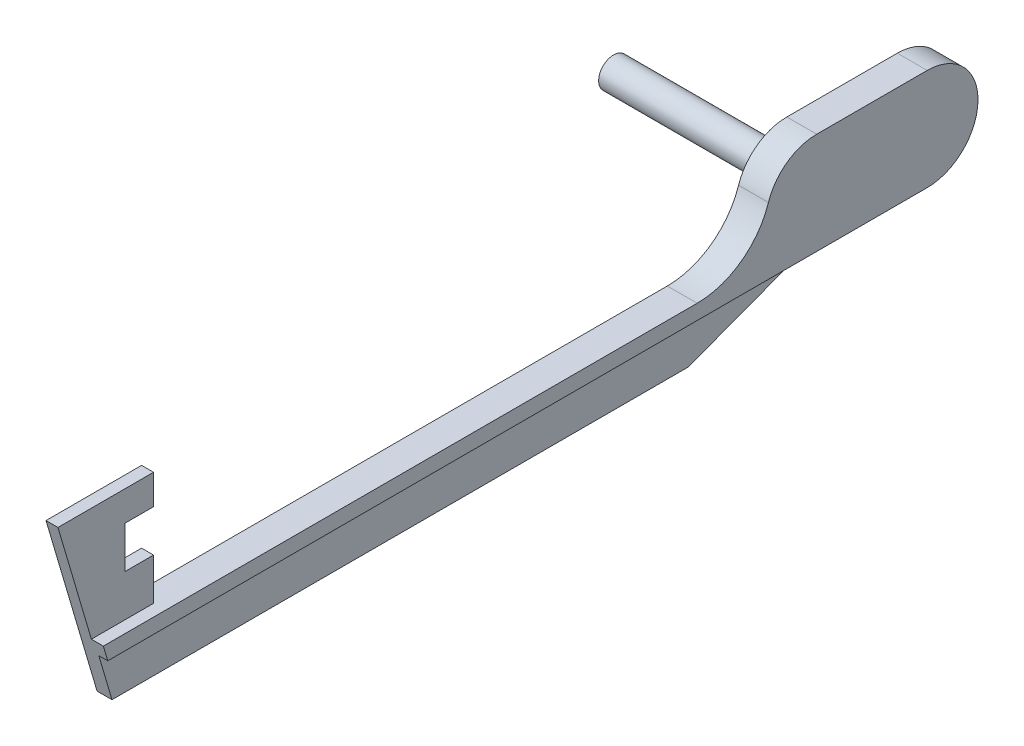
ISO-10303-21;
HEADER;
FILE_DESCRIPTION(('STEP AP214'),'2;1');
FILE_NAME('part.step','',(''),(''),'','','');
FILE_SCHEMA(('AUTOMOTIVE_DESIGN { 1 0 10303 214 1 1 1 1 }'));
ENDSEC;
DATA;
#1=APPLICATION_CONTEXT('core data for automotive mechanical design processes');
#2=APPLICATION_PROTOCOL_DEFINITION('international standard','automotive_design',2000,#1);
#3=PRODUCT_CONTEXT('',#1,'mechanical');
#4=PRODUCT('Part','Part','',(#3));
#5=PRODUCT_RELATED_PRODUCT_CATEGORY('part','',(#4));
#6=PRODUCT_DEFINITION_FORMATION('','',#4);
#7=PRODUCT_DEFINITION_CONTEXT('part definition',#1,'design');
#8=PRODUCT_DEFINITION('design','',#6,#7);
#9=PRODUCT_DEFINITION_SHAPE('','',#8);
#10=(LENGTH_UNIT() NAMED_UNIT(*) SI_UNIT(.MILLI.,.METRE.));
#11=(NAMED_UNIT(*) PLANE_ANGLE_UNIT() SI_UNIT($,.RADIAN.));
#12=(NAMED_UNIT(*) SI_UNIT($,.STERADIAN.) SOLID_ANGLE_UNIT());
#13=UNCERTAINTY_MEASURE_WITH_UNIT(LENGTH_MEASURE(1.E-05),#10,'distance_accuracy_value','');
#14=(GEOMETRIC_REPRESENTATION_CONTEXT(3) GLOBAL_UNCERTAINTY_ASSIGNED_CONTEXT((#13)) GLOBAL_UNIT_ASSIGNED_CONTEXT((#10,
#11,#12)) REPRESENTATION_CONTEXT('',''));
#15=CARTESIAN_POINT('',(0.,0.,0.));
#16=DIRECTION('',(0.,0.,1.));
#17=DIRECTION('',(1.,0.,0.));
#18=AXIS2_PLACEMENT_3D('',#15,#16,#17);
#19=CARTESIAN_POINT('',(2.54,-3.048,0.));
#20=DIRECTION('',(0.,-1.,0.));
#21=DIRECTION('',(0.,0.,-1.));
#22=AXIS2_PLACEMENT_3D('',#19,#20,#21);
#23=PLANE('',#22);
#24=DIRECTION('',(0.,0.,1.));
#25=VECTOR('',#24,1.);
#26=CARTESIAN_POINT('',(0.,-3.048,0.));
#27=LINE('',#26,#25);
#28=CARTESIAN_POINT('',(0.,-3.048,19.558));
#29=VERTEX_POINT('',#28);
#30=CARTESIAN_POINT('',(0.,-3.048,64.77));
#31=VERTEX_POINT('',#30);
#32=EDGE_CURVE('E265',#29,#31,#27,.T.);
#33=ORIENTED_EDGE('',*,*,#32,.T.);
#34=DIRECTION('',(1.,0.,0.));
#35=VECTOR('',#34,1.);
#36=CARTESIAN_POINT('',(0.254,-3.048,64.77));
#37=LINE('',#36,#35);
#38=CARTESIAN_POINT('',(0.508,-3.048,64.77));
#39=VERTEX_POINT('',#38);
#40=EDGE_CURVE('E239',#31,#39,#37,.T.);
#41=ORIENTED_EDGE('',*,*,#40,.T.);
#42=CARTESIAN_POINT('',(1.524,-3.048,64.77));
#43=VERTEX_POINT('',#42);
#44=EDGE_CURVE('E225',#39,#43,#37,.T.);
#45=ORIENTED_EDGE('',*,*,#44,.T.);
#46=DIRECTION('',(0.,0.,1.));
#47=VECTOR('',#46,1.);
#48=CARTESIAN_POINT('',(1.524,-3.04799999999999,0.));
#49=LINE('',#48,#47);
#50=CARTESIAN_POINT('',(1.524,-3.048,70.0535860198938));
#51=VERTEX_POINT('',#50);
#52=EDGE_CURVE('E203',#43,#51,#49,.T.);
#53=ORIENTED_EDGE('',*,*,#52,.T.);
#54=DIRECTION('',(-1.,0.,0.));
#55=VECTOR('',#54,1.);
#56=CARTESIAN_POINT('',(2.54,-3.048,70.0535860198938));
#57=LINE('',#56,#55);
#58=CARTESIAN_POINT('',(2.54,-3.048,70.0535860198938));
#59=VERTEX_POINT('',#58);
#60=EDGE_CURVE('E278',#59,#51,#57,.T.);
#61=ORIENTED_EDGE('',*,*,#60,.F.);
#62=DIRECTION('',(0.,0.,1.));
#63=VECTOR('',#62,1.);
#64=CARTESIAN_POINT('',(2.54,-3.048,0.));
#65=LINE('',#64,#63);
#66=CARTESIAN_POINT('',(2.54,-3.048,19.558));
#67=VERTEX_POINT('',#66);
#68=EDGE_CURVE('E276',#67,#59,#65,.T.);
#69=ORIENTED_EDGE('',*,*,#68,.F.);
#70=DIRECTION('',(-1.,0.,0.));
#71=VECTOR('',#70,1.);
#72=CARTESIAN_POINT('',(2.54,-3.048,19.558));
#73=LINE('',#72,#71);
#74=EDGE_CURVE('E293',#67,#29,#73,.T.);
#75=ORIENTED_EDGE('',*,*,#74,.T.);
#76=EDGE_LOOP('',(#33,#41,#45,#53,#61,#69,#75));
#77=FACE_BOUND('',#76,.T.);
#78=ADVANCED_FACE('F34',(#77),#23,.F.);
#79=CARTESIAN_POINT('',(2.54,-19.2384881202228,65.2823001978979));
#80=DIRECTION('',(0.,0.282677628483706,-0.959214969834618));
#81=DIRECTION('',(0.,0.959214969834619,0.282677628483706));
#82=AXIS2_PLACEMENT_3D('',#79,#80,#81);
#83=PLANE('',#82);
#84=DIRECTION('',(1.,0.,0.));
#85=VECTOR('',#84,1.);
#86=CARTESIAN_POINT('',(0.254,6.604,72.898));
#87=LINE('',#86,#85);
#88=CARTESIAN_POINT('',(0.508,6.604,72.898));
#89=VERTEX_POINT('',#88);
#90=CARTESIAN_POINT('',(1.524,6.604,72.898));
#91=VERTEX_POINT('',#90);
#92=EDGE_CURVE('E226',#89,#91,#87,.T.);
#93=ORIENTED_EDGE('',*,*,#92,.F.);
#94=DIRECTION('',(0.,-0.959214969834619,-0.282677628483706));
#95=VECTOR('',#94,1.);
#96=CARTESIAN_POINT('',(0.508,-19.2384881202228,65.2823001978979));
#97=LINE('',#96,#95);
#98=CARTESIAN_POINT('',(0.508,-8.12800000000001,68.5565260303642));
#99=VERTEX_POINT('',#98);
#100=EDGE_CURVE('E197',#89,#99,#97,.T.);
#101=ORIENTED_EDGE('',*,*,#100,.T.);
#102=DIRECTION('',(-1.,0.,0.));
#103=VECTOR('',#102,1.);
#104=CARTESIAN_POINT('',(1.778,-8.128,68.5565260303642));
#105=LINE('',#104,#103);
#106=CARTESIAN_POINT('',(1.778,-8.128,68.5565260303642));
#107=VERTEX_POINT('',#106);
#108=EDGE_CURVE('E186',#107,#99,#105,.T.);
#109=ORIENTED_EDGE('',*,*,#108,.F.);
#110=DIRECTION('',(0.,-0.959214969834618,-0.282677628483706));
#111=VECTOR('',#110,1.);
#112=CARTESIAN_POINT('',(1.778,-19.2384881202228,65.2823001978979));
#113=LINE('',#112,#111);
#114=CARTESIAN_POINT('',(1.778,-4.318,69.6793210225114));
#115=VERTEX_POINT('',#114);
#116=EDGE_CURVE('E248',#115,#107,#113,.T.);
#117=ORIENTED_EDGE('',*,*,#116,.F.);
#118=DIRECTION('',(-1.,0.,0.));
#119=VECTOR('',#118,1.);
#120=CARTESIAN_POINT('',(2.54,-4.318,69.6793210225114));
#121=LINE('',#120,#119);
#122=CARTESIAN_POINT('',(2.54,-4.318,69.6793210225114));
#123=VERTEX_POINT('',#122);
#124=EDGE_CURVE('E11',#123,#115,#121,.T.);
#125=ORIENTED_EDGE('',*,*,#124,.F.);
#126=DIRECTION('',(0.,-0.959214969834618,-0.282677628483706));
#127=VECTOR('',#126,1.);
#128=CARTESIAN_POINT('',(2.54,-19.2384881202228,65.2823001978979));
#129=LINE('',#128,#127);
#130=EDGE_CURVE('E262',#59,#123,#129,.T.);
#131=ORIENTED_EDGE('',*,*,#130,.F.);
#132=ORIENTED_EDGE('',*,*,#60,.T.);
#133=DIRECTION('',(0.,-0.959214969834618,-0.282677628483706));
#134=VECTOR('',#133,1.);
#135=CARTESIAN_POINT('',(1.524,-19.2384881202228,65.2823001978979));
#136=LINE('',#135,#134);
#137=EDGE_CURVE('E57',#91,#51,#136,.T.);
#138=ORIENTED_EDGE('',*,*,#137,.F.);
#139=EDGE_LOOP('',(#93,#101,#109,#117,#125,#131,#132,#138));
#140=FACE_BOUND('',#139,.T.);
#141=ADVANCED_FACE('F36',(#140),#83,.F.);
#142=CARTESIAN_POINT('',(2.54,-4.318,0.));
#143=DIRECTION('',(0.,-1.,0.));
#144=DIRECTION('',(0.,0.,-1.));
#145=AXIS2_PLACEMENT_3D('',#142,#143,#144);
#146=PLANE('',#145);
#147=DIRECTION('',(-1.,0.,0.));
#148=VECTOR('',#147,1.);
#149=CARTESIAN_POINT('',(1.778,-4.318,9.398));
#150=LINE('',#149,#148);
#151=CARTESIAN_POINT('',(1.778,-4.318,9.398));
#152=VERTEX_POINT('',#151);
#153=CARTESIAN_POINT('',(0.,-4.318,9.398));
#154=VERTEX_POINT('',#153);
#155=EDGE_CURVE('E258',#152,#154,#150,.T.);
#156=ORIENTED_EDGE('',*,*,#155,.T.);
#157=DIRECTION('',(0.,0.,1.));
#158=VECTOR('',#157,1.);
#159=CARTESIAN_POINT('',(0.,-4.318,0.));
#160=LINE('',#159,#158);
#161=CARTESIAN_POINT('',(0.,-4.318,0.));
#162=VERTEX_POINT('',#161);
#163=EDGE_CURVE('E261',#162,#154,#160,.T.);
#164=ORIENTED_EDGE('',*,*,#163,.F.);
#165=DIRECTION('',(-1.,0.,0.));
#166=VECTOR('',#165,1.);
#167=CARTESIAN_POINT('',(2.54,-4.318,0.));
#168=LINE('',#167,#166);
#169=CARTESIAN_POINT('',(2.54,-4.318,0.));
#170=VERTEX_POINT('',#169);
#171=EDGE_CURVE('E42',#170,#162,#168,.T.);
#172=ORIENTED_EDGE('',*,*,#171,.F.);
#173=DIRECTION('',(0.,0.,1.));
#174=VECTOR('',#173,1.);
#175=CARTESIAN_POINT('',(2.54,-4.318,0.));
#176=LINE('',#175,#174);
#177=EDGE_CURVE('E264',#170,#123,#176,.T.);
#178=ORIENTED_EDGE('',*,*,#177,.T.);
#179=ORIENTED_EDGE('',*,*,#124,.T.);
#180=DIRECTION('',(0.,0.,1.));
#181=VECTOR('',#180,1.);
#182=CARTESIAN_POINT('',(1.778,-4.318,0.));
#183=LINE('',#182,#181);
#184=EDGE_CURVE('E245',#152,#115,#183,.T.);
#185=ORIENTED_EDGE('',*,*,#184,.F.);
#186=EDGE_LOOP('',(#156,#164,#172,#178,#179,#185));
#187=FACE_BOUND('',#186,.T.);
#188=ADVANCED_FACE('F316',(#187),#146,.T.);
#189=CARTESIAN_POINT('',(2.54,0.,0.));
#190=DIRECTION('',(-1.,0.,0.));
#191=DIRECTION('',(0.,0.,1.));
#192=AXIS2_PLACEMENT_3D('',#189,#190,#191);
#193=CYLINDRICAL_SURFACE('',#192,4.318);
#194=CARTESIAN_POINT('',(0.,0.,0.));
#195=DIRECTION('',(1.,0.,0.));
#196=DIRECTION('',(0.,0.,-1.));
#197=AXIS2_PLACEMENT_3D('',#194,#195,#196);
#198=CIRCLE('',#197,4.318);
#199=CARTESIAN_POINT('',(0.,4.318,0.));
#200=VERTEX_POINT('',#199);
#201=EDGE_CURVE('E281',#162,#200,#198,.T.);
#202=ORIENTED_EDGE('',*,*,#201,.T.);
#203=DIRECTION('',(-1.,0.,0.));
#204=VECTOR('',#203,1.);
#205=CARTESIAN_POINT('',(2.54,4.318,0.));
#206=LINE('',#205,#204);
#207=CARTESIAN_POINT('',(2.54,4.318,0.));
#208=VERTEX_POINT('',#207);
#209=EDGE_CURVE('E302',#208,#200,#206,.T.);
#210=ORIENTED_EDGE('',*,*,#209,.F.);
#211=CARTESIAN_POINT('',(2.54,0.,0.));
#212=DIRECTION('',(1.,0.,0.));
#213=DIRECTION('',(0.,0.,-1.));
#214=AXIS2_PLACEMENT_3D('',#211,#212,#213);
#215=CIRCLE('',#214,4.318);
#216=EDGE_CURVE('E268',#170,#208,#215,.T.);
#217=ORIENTED_EDGE('',*,*,#216,.F.);
#218=ORIENTED_EDGE('',*,*,#171,.T.);
#219=EDGE_LOOP('',(#202,#210,#217,#218));
#220=FACE_BOUND('',#219,.T.);
#221=ADVANCED_FACE('F307',(#220),#193,.T.);
#222=CARTESIAN_POINT('',(2.54,4.318,0.));
#223=DIRECTION('',(0.,-1.,0.));
#224=DIRECTION('',(0.,0.,-1.));
#225=AXIS2_PLACEMENT_3D('',#222,#223,#224);
#226=PLANE('',#225);
#227=DIRECTION('',(0.,0.,1.));
#228=VECTOR('',#227,1.);
#229=CARTESIAN_POINT('',(0.,4.318,0.));
#230=LINE('',#229,#228);
#231=CARTESIAN_POINT('',(0.,4.318,9.398));
#232=VERTEX_POINT('',#231);
#233=EDGE_CURVE('E283',#200,#232,#230,.T.);
#234=ORIENTED_EDGE('',*,*,#233,.T.);
#235=DIRECTION('',(-1.,0.,0.));
#236=VECTOR('',#235,1.);
#237=CARTESIAN_POINT('',(2.54,4.318,9.398));
#238=LINE('',#237,#236);
#239=CARTESIAN_POINT('',(2.54,4.318,9.398));
#240=VERTEX_POINT('',#239);
#241=EDGE_CURVE('E299',#240,#232,#238,.T.);
#242=ORIENTED_EDGE('',*,*,#241,.F.);
#243=DIRECTION('',(0.,0.,1.));
#244=VECTOR('',#243,1.);
#245=CARTESIAN_POINT('',(2.54,4.318,0.));
#246=LINE('',#245,#244);
#247=EDGE_CURVE('E270',#208,#240,#246,.T.);
#248=ORIENTED_EDGE('',*,*,#247,.F.);
#249=ORIENTED_EDGE('',*,*,#209,.T.);
#250=EDGE_LOOP('',(#234,#242,#248,#249));
#251=FACE_BOUND('',#250,.T.);
#252=ADVANCED_FACE('F341',(#251),#226,.F.);
#253=CARTESIAN_POINT('',(2.54,0.,9.398));
#254=DIRECTION('',(-1.,0.,0.));
#255=DIRECTION('',(0.,0.,1.));
#256=AXIS2_PLACEMENT_3D('',#253,#254,#255);
#257=CYLINDRICAL_SURFACE('',#256,4.318);
#258=CARTESIAN_POINT('',(0.,0.,9.398));
#259=DIRECTION('',(1.,0.,0.));
#260=DIRECTION('',(0.,0.,-1.));
#261=AXIS2_PLACEMENT_3D('',#258,#259,#260);
#262=CIRCLE('',#261,4.318);
#263=CARTESIAN_POINT('',(0.,1.34263088897993,13.5019573945104));
#264=VERTEX_POINT('',#263);
#265=EDGE_CURVE('E285',#232,#264,#262,.T.);
#266=ORIENTED_EDGE('',*,*,#265,.T.);
#267=DIRECTION('',(-1.,0.,0.));
#268=VECTOR('',#267,1.);
#269=CARTESIAN_POINT('',(2.54,1.34263088897993,13.5019573945104));
#270=LINE('',#269,#268);
#271=CARTESIAN_POINT('',(2.54,1.34263088897993,13.5019573945104));
#272=VERTEX_POINT('',#271);
#273=EDGE_CURVE('E296',#272,#264,#270,.T.);
#274=ORIENTED_EDGE('',*,*,#273,.F.);
#275=CARTESIAN_POINT('',(2.54,0.,9.398));
#276=DIRECTION('',(1.,0.,0.));
#277=DIRECTION('',(0.,0.,-1.));
#278=AXIS2_PLACEMENT_3D('',#275,#276,#277);
#279=CIRCLE('',#278,4.318);
#280=EDGE_CURVE('E272',#240,#272,#279,.T.);
#281=ORIENTED_EDGE('',*,*,#280,.F.);
#282=ORIENTED_EDGE('',*,*,#241,.T.);
#283=EDGE_LOOP('',(#266,#274,#281,#282));
#284=FACE_BOUND('',#283,.T.);
#285=ADVANCED_FACE('F336',(#284),#257,.T.);
#286=CARTESIAN_POINT('',(2.54,3.32389655172413,19.558));
#287=DIRECTION('',(-1.,0.,0.));
#288=DIRECTION('',(0.,0.,1.));
#289=AXIS2_PLACEMENT_3D('',#286,#287,#288);
#290=CYLINDRICAL_SURFACE('',#289,6.37189655172413);
#291=CARTESIAN_POINT('',(0.,3.32389655172413,19.558));
#292=DIRECTION('',(1.,0.,0.));
#293=DIRECTION('',(0.,0.,-1.));
#294=AXIS2_PLACEMENT_3D('',#291,#292,#293);
#295=CIRCLE('',#294,6.37189655172413);
#296=EDGE_CURVE('E287',#264,#29,#295,.F.);
#297=ORIENTED_EDGE('',*,*,#296,.T.);
#298=ORIENTED_EDGE('',*,*,#74,.F.);
#299=CARTESIAN_POINT('',(2.54,3.32389655172413,19.558));
#300=DIRECTION('',(1.,0.,0.));
#301=DIRECTION('',(0.,0.,-1.));
#302=AXIS2_PLACEMENT_3D('',#299,#300,#301);
#303=CIRCLE('',#302,6.37189655172413);
#304=EDGE_CURVE('E274',#272,#67,#303,.F.);
#305=ORIENTED_EDGE('',*,*,#304,.F.);
#306=ORIENTED_EDGE('',*,*,#273,.T.);
#307=EDGE_LOOP('',(#297,#298,#305,#306));
#308=FACE_BOUND('',#307,.T.);
#309=ADVANCED_FACE('F333',(#308),#290,.F.);
#310=CARTESIAN_POINT('',(2.54,0.,0.));
#311=DIRECTION('',(1.,0.,0.));
#312=DIRECTION('',(0.,0.,-1.));
#313=AXIS2_PLACEMENT_3D('',#310,#311,#312);
#314=PLANE('',#313);
#315=ORIENTED_EDGE('',*,*,#130,.T.);
#316=ORIENTED_EDGE('',*,*,#177,.F.);
#317=ORIENTED_EDGE('',*,*,#216,.T.);
#318=ORIENTED_EDGE('',*,*,#247,.T.);
#319=ORIENTED_EDGE('',*,*,#280,.T.);
#320=ORIENTED_EDGE('',*,*,#304,.T.);
#321=ORIENTED_EDGE('',*,*,#68,.T.);
#322=EDGE_LOOP('',(#315,#316,#317,#318,#319,#320,#321));
#323=FACE_BOUND('',#322,.T.);
#324=ADVANCED_FACE('F343',(#323),#314,.T.);
#325=CARTESIAN_POINT('',(0.,0.,0.));
#326=DIRECTION('',(1.,0.,0.));
#327=DIRECTION('',(0.,0.,-1.));
#328=AXIS2_PLACEMENT_3D('',#325,#326,#327);
#329=PLANE('',#328);
#330=CARTESIAN_POINT('',(0.,0.,9.144));
#331=DIRECTION('',(1.,0.,0.));
#332=DIRECTION('',(0.,0.,-1.));
#333=AXIS2_PLACEMENT_3D('',#330,#331,#332);
#334=CIRCLE('',#333,1.27);
#335=CARTESIAN_POINT('',(0.,0.,7.874));
#336=VERTEX_POINT('',#335);
#337=EDGE_CURVE('E199',#336,#336,#334,.T.);
#338=ORIENTED_EDGE('',*,*,#337,.T.);
#339=EDGE_LOOP('',(#338));
#340=FACE_BOUND('',#339,.T.);
#341=DIRECTION('',(0.,0.,1.));
#342=VECTOR('',#341,1.);
#343=CARTESIAN_POINT('',(0.,-8.128,0.));
#344=LINE('',#343,#342);
#345=CARTESIAN_POINT('',(0.,-8.128,19.558));
#346=VERTEX_POINT('',#345);
#347=CARTESIAN_POINT('',(0.,-8.12800000000001,64.77));
#348=VERTEX_POINT('',#347);
#349=EDGE_CURVE('E246',#346,#348,#344,.T.);
#350=ORIENTED_EDGE('',*,*,#349,.T.);
#351=DIRECTION('',(0.,1.,0.));
#352=VECTOR('',#351,1.);
#353=CARTESIAN_POINT('',(0.,-8.12800000000001,64.77));
#354=LINE('',#353,#352);
#355=EDGE_CURVE('E171',#348,#31,#354,.T.);
#356=ORIENTED_EDGE('',*,*,#355,.T.);
#357=ORIENTED_EDGE('',*,*,#32,.F.);
#358=ORIENTED_EDGE('',*,*,#296,.F.);
#359=ORIENTED_EDGE('',*,*,#265,.F.);
#360=ORIENTED_EDGE('',*,*,#233,.F.);
#361=ORIENTED_EDGE('',*,*,#201,.F.);
#362=ORIENTED_EDGE('',*,*,#163,.T.);
#363=DIRECTION('',(0.,-0.351123441588392,0.936329177569045));
#364=VECTOR('',#363,1.);
#365=CARTESIAN_POINT('',(0.,-0.695890410958908,-0.26095890410959));
#366=LINE('',#365,#364);
#367=EDGE_CURVE('E228',#154,#346,#366,.T.);
#368=ORIENTED_EDGE('',*,*,#367,.T.);
#369=EDGE_LOOP('',(#350,#356,#357,#358,#359,#360,#361,#362,#368));
#370=FACE_BOUND('',#369,.T.);
#371=ADVANCED_FACE('F314',(#340,#370),#329,.F.);
#372=CARTESIAN_POINT('',(1.778,-0.695890410958908,-0.26095890410959));
#373=DIRECTION('',(0.,-0.936329177569045,-0.351123441588392));
#374=DIRECTION('',(0.,0.351123441588392,-0.936329177569045));
#375=AXIS2_PLACEMENT_3D('',#372,#373,#374);
#376=PLANE('',#375);
#377=ORIENTED_EDGE('',*,*,#367,.F.);
#378=ORIENTED_EDGE('',*,*,#155,.F.);
#379=DIRECTION('',(0.,-0.351123441588392,0.936329177569045));
#380=VECTOR('',#379,1.);
#381=CARTESIAN_POINT('',(1.778,-0.695890410958908,-0.26095890410959));
#382=LINE('',#381,#380);
#383=CARTESIAN_POINT('',(1.778,-8.128,19.558));
#384=VERTEX_POINT('',#383);
#385=EDGE_CURVE('E242',#152,#384,#382,.T.);
#386=ORIENTED_EDGE('',*,*,#385,.T.);
#387=DIRECTION('',(-1.,0.,0.));
#388=VECTOR('',#387,1.);
#389=CARTESIAN_POINT('',(1.778,-8.128,19.558));
#390=LINE('',#389,#388);
#391=EDGE_CURVE('E252',#384,#346,#390,.T.);
#392=ORIENTED_EDGE('',*,*,#391,.T.);
#393=EDGE_LOOP('',(#377,#378,#386,#392));
#394=FACE_BOUND('',#393,.T.);
#395=ADVANCED_FACE('F320',(#394),#376,.T.);
#396=CARTESIAN_POINT('',(1.778,-8.128,0.));
#397=DIRECTION('',(0.,-1.,0.));
#398=DIRECTION('',(0.,0.,-1.));
#399=AXIS2_PLACEMENT_3D('',#396,#397,#398);
#400=PLANE('',#399);
#401=DIRECTION('',(0.,0.,-1.));
#402=VECTOR('',#401,1.);
#403=CARTESIAN_POINT('',(0.508,-8.12800000000001,72.898));
#404=LINE('',#403,#402);
#405=CARTESIAN_POINT('',(0.508,-8.12800000000001,64.77));
#406=VERTEX_POINT('',#405);
#407=EDGE_CURVE('E166',#99,#406,#404,.T.);
#408=ORIENTED_EDGE('',*,*,#407,.T.);
#409=DIRECTION('',(-1.,0.,0.));
#410=VECTOR('',#409,1.);
#411=CARTESIAN_POINT('',(0.508,-8.12800000000001,64.77));
#412=LINE('',#411,#410);
#413=EDGE_CURVE('E175',#406,#348,#412,.T.);
#414=ORIENTED_EDGE('',*,*,#413,.T.);
#415=ORIENTED_EDGE('',*,*,#349,.F.);
#416=ORIENTED_EDGE('',*,*,#391,.F.);
#417=DIRECTION('',(0.,0.,1.));
#418=VECTOR('',#417,1.);
#419=CARTESIAN_POINT('',(1.778,-8.128,0.));
#420=LINE('',#419,#418);
#421=EDGE_CURVE('E250',#384,#107,#420,.T.);
#422=ORIENTED_EDGE('',*,*,#421,.T.);
#423=ORIENTED_EDGE('',*,*,#108,.T.);
#424=EDGE_LOOP('',(#408,#414,#415,#416,#422,#423));
#425=FACE_BOUND('',#424,.T.);
#426=ADVANCED_FACE('F183',(#425),#400,.T.);
#427=CARTESIAN_POINT('',(1.778,0.,0.));
#428=DIRECTION('',(1.,0.,0.));
#429=DIRECTION('',(0.,0.,-1.));
#430=AXIS2_PLACEMENT_3D('',#427,#428,#429);
#431=PLANE('',#430);
#432=ORIENTED_EDGE('',*,*,#385,.F.);
#433=ORIENTED_EDGE('',*,*,#184,.T.);
#434=ORIENTED_EDGE('',*,*,#116,.T.);
#435=ORIENTED_EDGE('',*,*,#421,.F.);
#436=EDGE_LOOP('',(#432,#433,#434,#435));
#437=FACE_BOUND('',#436,.T.);
#438=ADVANCED_FACE('F323',(#437),#431,.T.);
#439=CARTESIAN_POINT('',(0.254,6.60400000000001,0.));
#440=DIRECTION('',(0.,1.,0.));
#441=DIRECTION('',(0.,0.,1.));
#442=AXIS2_PLACEMENT_3D('',#439,#440,#441);
#443=PLANE('',#442);
#444=DIRECTION('',(0.,0.,-1.));
#445=VECTOR('',#444,1.);
#446=CARTESIAN_POINT('',(0.508,6.604,72.898));
#447=LINE('',#446,#445);
#448=CARTESIAN_POINT('',(0.508,6.604,64.77));
#449=VERTEX_POINT('',#448);
#450=EDGE_CURVE('E187',#89,#449,#447,.T.);
#451=ORIENTED_EDGE('',*,*,#450,.F.);
#452=ORIENTED_EDGE('',*,*,#92,.T.);
#453=DIRECTION('',(0.,0.,1.));
#454=VECTOR('',#453,1.);
#455=CARTESIAN_POINT('',(1.524,6.60400000000001,0.));
#456=LINE('',#455,#454);
#457=CARTESIAN_POINT('',(1.524,6.604,64.77));
#458=VERTEX_POINT('',#457);
#459=EDGE_CURVE('E222',#458,#91,#456,.T.);
#460=ORIENTED_EDGE('',*,*,#459,.F.);
#461=DIRECTION('',(1.,0.,0.));
#462=VECTOR('',#461,1.);
#463=CARTESIAN_POINT('',(0.254,6.604,64.77));
#464=LINE('',#463,#462);
#465=EDGE_CURVE('E229',#449,#458,#464,.T.);
#466=ORIENTED_EDGE('',*,*,#465,.F.);
#467=EDGE_LOOP('',(#451,#452,#460,#466));
#468=FACE_BOUND('',#467,.T.);
#469=ADVANCED_FACE('F352',(#468),#443,.T.);
#470=CARTESIAN_POINT('',(0.254,0.,64.77));
#471=DIRECTION('',(0.,0.,-1.));
#472=DIRECTION('',(-1.,0.,0.));
#473=AXIS2_PLACEMENT_3D('',#470,#471,#472);
#474=PLANE('',#473);
#475=DIRECTION('',(0.,1.,0.));
#476=VECTOR('',#475,1.);
#477=CARTESIAN_POINT('',(0.508,-8.12800000000001,64.77));
#478=LINE('',#477,#476);
#479=CARTESIAN_POINT('',(0.508,4.064,64.77));
#480=VERTEX_POINT('',#479);
#481=EDGE_CURVE('E173',#480,#449,#478,.T.);
#482=ORIENTED_EDGE('',*,*,#481,.T.);
#483=ORIENTED_EDGE('',*,*,#465,.T.);
#484=DIRECTION('',(0.,1.,0.));
#485=VECTOR('',#484,1.);
#486=CARTESIAN_POINT('',(1.524,0.,64.77));
#487=LINE('',#486,#485);
#488=CARTESIAN_POINT('',(1.524,4.064,64.77));
#489=VERTEX_POINT('',#488);
#490=EDGE_CURVE('E219',#489,#458,#487,.T.);
#491=ORIENTED_EDGE('',*,*,#490,.F.);
#492=DIRECTION('',(1.,0.,0.));
#493=VECTOR('',#492,1.);
#494=CARTESIAN_POINT('',(0.254,4.064,64.77));
#495=LINE('',#494,#493);
#496=EDGE_CURVE('E231',#480,#489,#495,.T.);
#497=ORIENTED_EDGE('',*,*,#496,.F.);
#498=EDGE_LOOP('',(#482,#483,#491,#497));
#499=FACE_BOUND('',#498,.T.);
#500=ADVANCED_FACE('F356',(#499),#474,.T.);
#501=CARTESIAN_POINT('',(0.254,4.064,0.));
#502=DIRECTION('',(0.,-1.,0.));
#503=DIRECTION('',(0.,0.,-1.));
#504=AXIS2_PLACEMENT_3D('',#501,#502,#503);
#505=PLANE('',#504);
#506=DIRECTION('',(0.,0.,1.));
#507=VECTOR('',#506,1.);
#508=CARTESIAN_POINT('',(0.508,4.064,0.));
#509=LINE('',#508,#507);
#510=CARTESIAN_POINT('',(0.508,4.064,67.2005020070529));
#511=VERTEX_POINT('',#510);
#512=EDGE_CURVE('E195',#480,#511,#509,.T.);
#513=ORIENTED_EDGE('',*,*,#512,.F.);
#514=ORIENTED_EDGE('',*,*,#496,.T.);
#515=DIRECTION('',(0.,0.,-1.));
#516=VECTOR('',#515,1.);
#517=CARTESIAN_POINT('',(1.524,4.064,0.));
#518=LINE('',#517,#516);
#519=CARTESIAN_POINT('',(1.524,4.064,67.2005020070529));
#520=VERTEX_POINT('',#519);
#521=EDGE_CURVE('E216',#520,#489,#518,.T.);
#522=ORIENTED_EDGE('',*,*,#521,.F.);
#523=DIRECTION('',(1.,0.,0.));
#524=VECTOR('',#523,1.);
#525=CARTESIAN_POINT('',(0.254,4.064,67.2005020070529));
#526=LINE('',#525,#524);
#527=EDGE_CURVE('E233',#511,#520,#526,.T.);
#528=ORIENTED_EDGE('',*,*,#527,.F.);
#529=EDGE_LOOP('',(#513,#514,#522,#528));
#530=FACE_BOUND('',#529,.T.);
#531=ADVANCED_FACE('F457',(#530),#505,.T.);
#532=CARTESIAN_POINT('',(0.254,0.,67.2005020070529));
#533=DIRECTION('',(0.,0.,-1.));
#534=DIRECTION('',(-1.,0.,0.));
#535=AXIS2_PLACEMENT_3D('',#532,#533,#534);
#536=PLANE('',#535);
#537=DIRECTION('',(0.,-1.,0.));
#538=VECTOR('',#537,1.);
#539=CARTESIAN_POINT('',(0.508,0.,67.2005020070529));
#540=LINE('',#539,#538);
#541=CARTESIAN_POINT('',(0.508,0.508,67.2005020070529));
#542=VERTEX_POINT('',#541);
#543=EDGE_CURVE('E193',#511,#542,#540,.T.);
#544=ORIENTED_EDGE('',*,*,#543,.F.);
#545=ORIENTED_EDGE('',*,*,#527,.T.);
#546=DIRECTION('',(0.,1.,0.));
#547=VECTOR('',#546,1.);
#548=CARTESIAN_POINT('',(1.524,0.,67.2005020070529));
#549=LINE('',#548,#547);
#550=CARTESIAN_POINT('',(1.524,0.508,67.2005020070529));
#551=VERTEX_POINT('',#550);
#552=EDGE_CURVE('E213',#551,#520,#549,.T.);
#553=ORIENTED_EDGE('',*,*,#552,.F.);
#554=DIRECTION('',(1.,0.,0.));
#555=VECTOR('',#554,1.);
#556=CARTESIAN_POINT('',(0.254,0.508,67.2005020070529));
#557=LINE('',#556,#555);
#558=EDGE_CURVE('E235',#542,#551,#557,.T.);
#559=ORIENTED_EDGE('',*,*,#558,.F.);
#560=EDGE_LOOP('',(#544,#545,#553,#559));
#561=FACE_BOUND('',#560,.T.);
#562=ADVANCED_FACE('F464',(#561),#536,.T.);
#563=CARTESIAN_POINT('',(0.254,0.508000000000009,0.));
#564=DIRECTION('',(0.,1.,0.));
#565=DIRECTION('',(0.,0.,1.));
#566=AXIS2_PLACEMENT_3D('',#563,#564,#565);
#567=PLANE('',#566);
#568=DIRECTION('',(0.,0.,-1.));
#569=VECTOR('',#568,1.);
#570=CARTESIAN_POINT('',(0.508,0.508000000000009,0.));
#571=LINE('',#570,#569);
#572=CARTESIAN_POINT('',(0.508,0.508000000000001,64.77));
#573=VERTEX_POINT('',#572);
#574=EDGE_CURVE('E49',#542,#573,#571,.T.);
#575=ORIENTED_EDGE('',*,*,#574,.F.);
#576=ORIENTED_EDGE('',*,*,#558,.T.);
#577=DIRECTION('',(0.,0.,1.));
#578=VECTOR('',#577,1.);
#579=CARTESIAN_POINT('',(1.524,0.508000000000009,0.));
#580=LINE('',#579,#578);
#581=CARTESIAN_POINT('',(1.524,0.508000000000001,64.77));
#582=VERTEX_POINT('',#581);
#583=EDGE_CURVE('E210',#582,#551,#580,.T.);
#584=ORIENTED_EDGE('',*,*,#583,.F.);
#585=DIRECTION('',(1.,0.,0.));
#586=VECTOR('',#585,1.);
#587=CARTESIAN_POINT('',(0.254,0.508000000000001,64.77));
#588=LINE('',#587,#586);
#589=EDGE_CURVE('E237',#573,#582,#588,.T.);
#590=ORIENTED_EDGE('',*,*,#589,.F.);
#591=EDGE_LOOP('',(#575,#576,#584,#590));
#592=FACE_BOUND('',#591,.T.);
#593=ADVANCED_FACE('F365',(#592),#567,.T.);
#594=CARTESIAN_POINT('',(0.254,0.,64.77));
#595=DIRECTION('',(0.,0.,-1.));
#596=DIRECTION('',(-1.,0.,0.));
#597=AXIS2_PLACEMENT_3D('',#594,#595,#596);
#598=PLANE('',#597);
#599=EDGE_CURVE('E168',#39,#573,#478,.T.);
#600=ORIENTED_EDGE('',*,*,#599,.T.);
#601=ORIENTED_EDGE('',*,*,#589,.T.);
#602=DIRECTION('',(0.,1.,0.));
#603=VECTOR('',#602,1.);
#604=CARTESIAN_POINT('',(1.524,0.,64.77));
#605=LINE('',#604,#603);
#606=EDGE_CURVE('E207',#43,#582,#605,.T.);
#607=ORIENTED_EDGE('',*,*,#606,.F.);
#608=ORIENTED_EDGE('',*,*,#44,.F.);
#609=EDGE_LOOP('',(#600,#601,#607,#608));
#610=FACE_BOUND('',#609,.T.);
#611=ADVANCED_FACE('F361',(#610),#598,.T.);
#612=CARTESIAN_POINT('',(1.524,0.,0.));
#613=DIRECTION('',(1.,0.,0.));
#614=DIRECTION('',(0.,0.,-1.));
#615=AXIS2_PLACEMENT_3D('',#612,#613,#614);
#616=PLANE('',#615);
#617=ORIENTED_EDGE('',*,*,#52,.F.);
#618=ORIENTED_EDGE('',*,*,#606,.T.);
#619=ORIENTED_EDGE('',*,*,#583,.T.);
#620=ORIENTED_EDGE('',*,*,#552,.T.);
#621=ORIENTED_EDGE('',*,*,#521,.T.);
#622=ORIENTED_EDGE('',*,*,#490,.T.);
#623=ORIENTED_EDGE('',*,*,#459,.T.);
#624=ORIENTED_EDGE('',*,*,#137,.T.);
#625=EDGE_LOOP('',(#617,#618,#619,#620,#621,#622,#623,#624));
#626=FACE_BOUND('',#625,.T.);
#627=ADVANCED_FACE('F368',(#626),#616,.T.);
#628=CARTESIAN_POINT('',(-14.986,0.,9.144));
#629=DIRECTION('',(1.,0.,0.));
#630=DIRECTION('',(0.,0.,-1.));
#631=AXIS2_PLACEMENT_3D('',#628,#629,#630);
#632=CYLINDRICAL_SURFACE('',#631,1.27);
#633=CARTESIAN_POINT('',(-14.986,0.,9.144));
#634=DIRECTION('',(1.,0.,0.));
#635=DIRECTION('',(0.,0.,-1.));
#636=AXIS2_PLACEMENT_3D('',#633,#634,#635);
#637=CIRCLE('',#636,1.27);
#638=CARTESIAN_POINT('',(-14.986,0.,7.874));
#639=VERTEX_POINT('',#638);
#640=EDGE_CURVE('E200',#639,#639,#637,.T.);
#641=ORIENTED_EDGE('',*,*,#640,.T.);
#642=EDGE_LOOP('',(#641));
#643=FACE_BOUND('',#642,.T.);
#644=ORIENTED_EDGE('',*,*,#337,.F.);
#645=EDGE_LOOP('',(#644));
#646=FACE_BOUND('',#645,.T.);
#647=ADVANCED_FACE('F370',(#643,#646),#632,.T.);
#648=CARTESIAN_POINT('',(-14.986,0.,0.));
#649=DIRECTION('',(1.,0.,0.));
#650=DIRECTION('',(0.,0.,-1.));
#651=AXIS2_PLACEMENT_3D('',#648,#649,#650);
#652=PLANE('',#651);
#653=ORIENTED_EDGE('',*,*,#640,.F.);
#654=EDGE_LOOP('',(#653));
#655=FACE_BOUND('',#654,.T.);
#656=ADVANCED_FACE('F376',(#655),#652,.F.);
#657=CARTESIAN_POINT('',(0.508,-8.12800000000001,72.898));
#658=DIRECTION('',(1.,0.,0.));
#659=DIRECTION('',(0.,0.,-1.));
#660=AXIS2_PLACEMENT_3D('',#657,#658,#659);
#661=PLANE('',#660);
#662=ORIENTED_EDGE('',*,*,#450,.T.);
#663=ORIENTED_EDGE('',*,*,#481,.F.);
#664=ORIENTED_EDGE('',*,*,#512,.T.);
#665=ORIENTED_EDGE('',*,*,#543,.T.);
#666=ORIENTED_EDGE('',*,*,#574,.T.);
#667=ORIENTED_EDGE('',*,*,#599,.F.);
#668=EDGE_CURVE('E162',#406,#39,#478,.T.);
#669=ORIENTED_EDGE('',*,*,#668,.F.);
#670=ORIENTED_EDGE('',*,*,#407,.F.);
#671=ORIENTED_EDGE('',*,*,#100,.F.);
#672=EDGE_LOOP('',(#662,#663,#664,#665,#666,#667,#669,#670,#671));
#673=FACE_BOUND('',#672,.T.);
#674=ADVANCED_FACE('F164',(#673),#661,.F.);
#675=CARTESIAN_POINT('',(0.508,-8.12800000000001,64.77));
#676=DIRECTION('',(0.,0.,-1.));
#677=DIRECTION('',(0.,1.,0.));
#678=AXIS2_PLACEMENT_3D('',#675,#676,#677);
#679=PLANE('',#678);
#680=ORIENTED_EDGE('',*,*,#355,.F.);
#681=ORIENTED_EDGE('',*,*,#413,.F.);
#682=ORIENTED_EDGE('',*,*,#668,.T.);
#683=ORIENTED_EDGE('',*,*,#40,.F.);
#684=EDGE_LOOP('',(#680,#681,#682,#683));
#685=FACE_BOUND('',#684,.T.);
#686=ADVANCED_FACE('F176',(#685),#679,.F.);
#687=CLOSED_SHELL('',(#78,#141,#188,#221,#252,#285,#309,#324,#371,#395,#426,#438,#469,#500,#531,
#562,#593,#611,#627,#647,#656,#674,#686));
#688=MANIFOLD_SOLID_BREP('B2',#687);
#689=ADVANCED_BREP_SHAPE_REPRESENTATION('',(#18,#688),#14);
#690=SHAPE_DEFINITION_REPRESENTATION(#9,#689);
ENDSEC;
END-ISO-10303-21;
